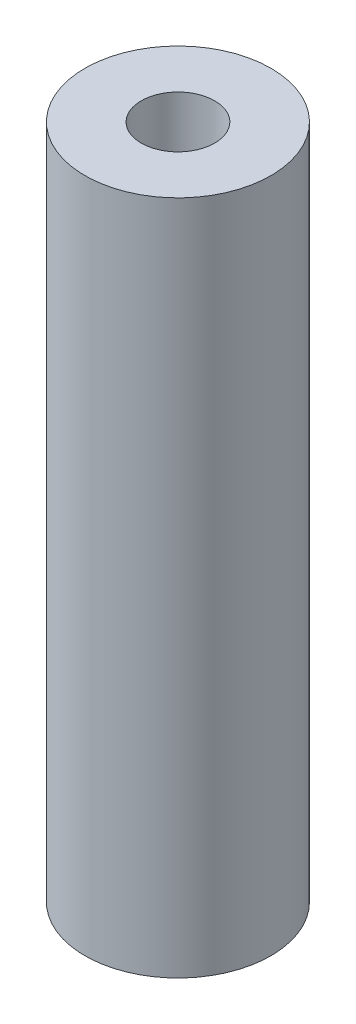
ISO-10303-21;
HEADER;
FILE_DESCRIPTION(('STEP AP214'),'2;1');
FILE_NAME('part.step','',(''),(''),'','','');
FILE_SCHEMA(('AUTOMOTIVE_DESIGN { 1 0 10303 214 1 1 1 1 }'));
ENDSEC;
DATA;
#1=APPLICATION_CONTEXT('core data for automotive mechanical design processes');
#2=APPLICATION_PROTOCOL_DEFINITION('international standard','automotive_design',2000,#1);
#3=PRODUCT_CONTEXT('',#1,'mechanical');
#4=PRODUCT('Part','Part','',(#3));
#5=PRODUCT_RELATED_PRODUCT_CATEGORY('part','',(#4));
#6=PRODUCT_DEFINITION_FORMATION('','',#4);
#7=PRODUCT_DEFINITION_CONTEXT('part definition',#1,'design');
#8=PRODUCT_DEFINITION('design','',#6,#7);
#9=PRODUCT_DEFINITION_SHAPE('','',#8);
#10=(LENGTH_UNIT() NAMED_UNIT(*) SI_UNIT(.MILLI.,.METRE.));
#11=(NAMED_UNIT(*) PLANE_ANGLE_UNIT() SI_UNIT($,.RADIAN.));
#12=(NAMED_UNIT(*) SI_UNIT($,.STERADIAN.) SOLID_ANGLE_UNIT());
#13=UNCERTAINTY_MEASURE_WITH_UNIT(LENGTH_MEASURE(1.E-05),#10,'distance_accuracy_value','');
#14=(GEOMETRIC_REPRESENTATION_CONTEXT(3) GLOBAL_UNCERTAINTY_ASSIGNED_CONTEXT((#13)) GLOBAL_UNIT_ASSIGNED_CONTEXT((#10,
#11,#12)) REPRESENTATION_CONTEXT('',''));
#15=CARTESIAN_POINT('',(0.,0.,0.));
#16=DIRECTION('',(0.,0.,1.));
#17=DIRECTION('',(1.,0.,0.));
#18=AXIS2_PLACEMENT_3D('',#15,#16,#17);
#19=CARTESIAN_POINT('',(0.,19.05,0.));
#20=DIRECTION('',(0.,1.,0.));
#21=DIRECTION('',(0.,0.,1.));
#22=AXIS2_PLACEMENT_3D('',#19,#20,#21);
#23=PLANE('',#22);
#24=CARTESIAN_POINT('',(0.,19.05,0.));
#25=DIRECTION('',(0.,1.,0.));
#26=DIRECTION('',(0.,0.,1.));
#27=AXIS2_PLACEMENT_3D('',#24,#25,#26);
#28=CIRCLE('',#27,5.2451);
#29=CARTESIAN_POINT('',(0.,19.05,-5.2451));
#30=VERTEX_POINT('',#29);
#31=EDGE_CURVE('E10',#30,#30,#28,.T.);
#32=ORIENTED_EDGE('',*,*,#31,.T.);
#33=EDGE_LOOP('',(#32));
#34=FACE_BOUND('',#33,.T.);
#35=CARTESIAN_POINT('',(0.,19.05,0.));
#36=DIRECTION('',(0.,1.,0.));
#37=DIRECTION('',(0.,0.,1.));
#38=AXIS2_PLACEMENT_3D('',#35,#36,#37);
#39=CIRCLE('',#38,2.0701);
#40=CARTESIAN_POINT('',(0.,19.05,-2.0701));
#41=VERTEX_POINT('',#40);
#42=EDGE_CURVE('E43',#41,#41,#39,.T.);
#43=ORIENTED_EDGE('',*,*,#42,.F.);
#44=EDGE_LOOP('',(#43));
#45=FACE_BOUND('',#44,.T.);
#46=ADVANCED_FACE('F32',(#34,#45),#23,.T.);
#47=CARTESIAN_POINT('',(0.,-19.05,0.));
#48=DIRECTION('',(0.,1.,0.));
#49=DIRECTION('',(0.,0.,1.));
#50=AXIS2_PLACEMENT_3D('',#47,#48,#49);
#51=PLANE('',#50);
#52=CARTESIAN_POINT('',(0.,-19.05,0.));
#53=DIRECTION('',(0.,1.,0.));
#54=DIRECTION('',(0.,0.,1.));
#55=AXIS2_PLACEMENT_3D('',#52,#53,#54);
#56=CIRCLE('',#55,5.2451);
#57=CARTESIAN_POINT('',(0.,-19.05,-5.2451));
#58=VERTEX_POINT('',#57);
#59=EDGE_CURVE('E36',#58,#58,#56,.T.);
#60=ORIENTED_EDGE('',*,*,#59,.F.);
#61=EDGE_LOOP('',(#60));
#62=FACE_BOUND('',#61,.T.);
#63=CARTESIAN_POINT('',(0.,-19.05,0.));
#64=DIRECTION('',(0.,1.,0.));
#65=DIRECTION('',(0.,0.,1.));
#66=AXIS2_PLACEMENT_3D('',#63,#64,#65);
#67=CIRCLE('',#66,2.0701);
#68=CARTESIAN_POINT('',(0.,-19.05,-2.0701));
#69=VERTEX_POINT('',#68);
#70=EDGE_CURVE('E45',#69,#69,#67,.T.);
#71=ORIENTED_EDGE('',*,*,#70,.T.);
#72=EDGE_LOOP('',(#71));
#73=FACE_BOUND('',#72,.T.);
#74=ADVANCED_FACE('F55',(#62,#73),#51,.F.);
#75=CARTESIAN_POINT('',(0.,19.05,0.));
#76=DIRECTION('',(0.,-1.,0.));
#77=DIRECTION('',(0.,0.,-1.));
#78=AXIS2_PLACEMENT_3D('',#75,#76,#77);
#79=CYLINDRICAL_SURFACE('',#78,5.2451);
#80=CARTESIAN_POINT('',(0.,19.05,-5.2451));
#81=CARTESIAN_POINT('',(0.,18.653125,-5.2451));
#82=CARTESIAN_POINT('',(0.,18.25625,-5.2451));
#83=CARTESIAN_POINT('',(0.,17.4625,-5.2451));
#84=CARTESIAN_POINT('',(0.,17.065625,-5.2451));
#85=CARTESIAN_POINT('',(0.,16.271875,-5.2451));
#86=CARTESIAN_POINT('',(0.,15.875,-5.2451));
#87=CARTESIAN_POINT('',(0.,15.08125,-5.2451));
#88=CARTESIAN_POINT('',(0.,14.684375,-5.2451));
#89=CARTESIAN_POINT('',(0.,13.890625,-5.2451));
#90=CARTESIAN_POINT('',(0.,13.49375,-5.2451));
#91=CARTESIAN_POINT('',(0.,12.7,-5.2451));
#92=CARTESIAN_POINT('',(0.,12.303125,-5.2451));
#93=CARTESIAN_POINT('',(0.,11.509375,-5.2451));
#94=CARTESIAN_POINT('',(0.,11.1125,-5.2451));
#95=CARTESIAN_POINT('',(0.,10.31875,-5.2451));
#96=CARTESIAN_POINT('',(0.,9.921875,-5.2451));
#97=CARTESIAN_POINT('',(0.,9.128125,-5.2451));
#98=CARTESIAN_POINT('',(0.,8.73125,-5.2451));
#99=CARTESIAN_POINT('',(0.,7.9375,-5.2451));
#100=CARTESIAN_POINT('',(0.,7.540625,-5.2451));
#101=CARTESIAN_POINT('',(0.,6.746875,-5.2451));
#102=CARTESIAN_POINT('',(0.,6.35,-5.2451));
#103=CARTESIAN_POINT('',(0.,5.55625,-5.2451));
#104=CARTESIAN_POINT('',(0.,5.159375,-5.2451));
#105=CARTESIAN_POINT('',(0.,4.365625,-5.2451));
#106=CARTESIAN_POINT('',(0.,3.96875,-5.2451));
#107=CARTESIAN_POINT('',(0.,3.175,-5.2451));
#108=CARTESIAN_POINT('',(0.,2.778125,-5.2451));
#109=CARTESIAN_POINT('',(0.,1.984375,-5.2451));
#110=CARTESIAN_POINT('',(0.,1.5875,-5.2451));
#111=CARTESIAN_POINT('',(0.,0.79375,-5.2451));
#112=CARTESIAN_POINT('',(0.,0.396875,-5.2451));
#113=CARTESIAN_POINT('',(0.,-0.396875,-5.2451));
#114=CARTESIAN_POINT('',(0.,-0.79375,-5.2451));
#115=CARTESIAN_POINT('',(0.,-1.5875,-5.2451));
#116=CARTESIAN_POINT('',(0.,-1.984375,-5.2451));
#117=CARTESIAN_POINT('',(0.,-2.778125,-5.2451));
#118=CARTESIAN_POINT('',(0.,-3.175,-5.2451));
#119=CARTESIAN_POINT('',(0.,-3.96875,-5.2451));
#120=CARTESIAN_POINT('',(0.,-4.365625,-5.2451));
#121=CARTESIAN_POINT('',(0.,-5.159375,-5.2451));
#122=CARTESIAN_POINT('',(0.,-5.55625,-5.2451));
#123=CARTESIAN_POINT('',(0.,-6.35,-5.2451));
#124=CARTESIAN_POINT('',(0.,-6.746875,-5.2451));
#125=CARTESIAN_POINT('',(0.,-7.540625,-5.2451));
#126=CARTESIAN_POINT('',(0.,-7.9375,-5.2451));
#127=CARTESIAN_POINT('',(0.,-8.73125,-5.2451));
#128=CARTESIAN_POINT('',(0.,-9.128125,-5.2451));
#129=CARTESIAN_POINT('',(0.,-9.921875,-5.2451));
#130=CARTESIAN_POINT('',(0.,-10.31875,-5.2451));
#131=CARTESIAN_POINT('',(0.,-11.1125,-5.2451));
#132=CARTESIAN_POINT('',(0.,-11.509375,-5.2451));
#133=CARTESIAN_POINT('',(0.,-12.303125,-5.2451));
#134=CARTESIAN_POINT('',(0.,-12.7,-5.2451));
#135=CARTESIAN_POINT('',(0.,-13.49375,-5.2451));
#136=CARTESIAN_POINT('',(0.,-13.890625,-5.2451));
#137=CARTESIAN_POINT('',(0.,-14.684375,-5.2451));
#138=CARTESIAN_POINT('',(0.,-15.08125,-5.2451));
#139=CARTESIAN_POINT('',(0.,-15.875,-5.2451));
#140=CARTESIAN_POINT('',(0.,-16.271875,-5.2451));
#141=CARTESIAN_POINT('',(0.,-17.065625,-5.2451));
#142=CARTESIAN_POINT('',(0.,-17.4625,-5.2451));
#143=CARTESIAN_POINT('',(0.,-18.25625,-5.2451));
#144=CARTESIAN_POINT('',(0.,-18.653125,-5.2451));
#145=CARTESIAN_POINT('',(0.,-19.05,-5.2451));
#146=B_SPLINE_CURVE_WITH_KNOTS('',3,(#80,#81,#82,#83,#84,#85,#86,#87,#88,#89,#90,#91,#92,#93,
#94,#95,#96,#97,#98,#99,#100,#101,#102,#103,#104,#105,#106,#107,#108,#109,#110,#111,#112,#113,
#114,#115,#116,#117,#118,#119,#120,#121,#122,#123,#124,#125,#126,#127,#128,#129,#130,#131,#132,
#133,#134,#135,#136,#137,#138,#139,#140,#141,#142,#143,#144,#145),.UNSPECIFIED.,.F.,.F.,(4,2,2,
2,2,2,2,2,2,2,2,2,2,2,2,2,2,2,2,2,2,2,2,2,2,2,2,2,2,2,2,2,4),(0.,1.190625,2.38125,3.571875,
4.7625,5.953125,7.14375,8.334375,9.525,10.715625,11.90625,13.096875,14.2875,15.478125,16.66875,
17.859375,19.05,20.240625,21.43125,22.621875,23.8125,25.003125,26.19375,27.384375,28.575,
29.765625,30.95625,32.146875,33.3375,34.528125,35.71875,36.909375,38.1),.UNSPECIFIED.);
#147=EDGE_CURVE('BSEAM34',#30,#58,#146,.T.);
#148=ORIENTED_EDGE('',*,*,#31,.F.);
#149=ORIENTED_EDGE('',*,*,#59,.T.);
#150=ORIENTED_EDGE('',*,*,#147,.T.);
#151=ORIENTED_EDGE('',*,*,#147,.F.);
#152=EDGE_LOOP('',(#148,#150,#149,#151));
#153=FACE_BOUND('',#152,.T.);
#154=ADVANCED_FACE('F34',(#153),#79,.T.);
#155=CARTESIAN_POINT('',(0.,19.05,0.));
#156=DIRECTION('',(0.,-1.,0.));
#157=DIRECTION('',(0.,0.,-1.));
#158=AXIS2_PLACEMENT_3D('',#155,#156,#157);
#159=CYLINDRICAL_SURFACE('',#158,2.0701);
#160=CARTESIAN_POINT('',(0.,19.05,-2.0701));
#161=CARTESIAN_POINT('',(0.,18.653125,-2.0701));
#162=CARTESIAN_POINT('',(0.,18.25625,-2.0701));
#163=CARTESIAN_POINT('',(0.,17.4625,-2.0701));
#164=CARTESIAN_POINT('',(0.,17.065625,-2.0701));
#165=CARTESIAN_POINT('',(0.,16.271875,-2.0701));
#166=CARTESIAN_POINT('',(0.,15.875,-2.0701));
#167=CARTESIAN_POINT('',(0.,15.08125,-2.0701));
#168=CARTESIAN_POINT('',(0.,14.684375,-2.0701));
#169=CARTESIAN_POINT('',(0.,13.890625,-2.0701));
#170=CARTESIAN_POINT('',(0.,13.49375,-2.0701));
#171=CARTESIAN_POINT('',(0.,12.7,-2.0701));
#172=CARTESIAN_POINT('',(0.,12.303125,-2.0701));
#173=CARTESIAN_POINT('',(0.,11.509375,-2.0701));
#174=CARTESIAN_POINT('',(0.,11.1125,-2.0701));
#175=CARTESIAN_POINT('',(0.,10.31875,-2.0701));
#176=CARTESIAN_POINT('',(0.,9.921875,-2.0701));
#177=CARTESIAN_POINT('',(0.,9.128125,-2.0701));
#178=CARTESIAN_POINT('',(0.,8.73125,-2.0701));
#179=CARTESIAN_POINT('',(0.,7.9375,-2.0701));
#180=CARTESIAN_POINT('',(0.,7.540625,-2.0701));
#181=CARTESIAN_POINT('',(0.,6.746875,-2.0701));
#182=CARTESIAN_POINT('',(0.,6.35,-2.0701));
#183=CARTESIAN_POINT('',(0.,5.55625,-2.0701));
#184=CARTESIAN_POINT('',(0.,5.159375,-2.0701));
#185=CARTESIAN_POINT('',(0.,4.365625,-2.0701));
#186=CARTESIAN_POINT('',(0.,3.96875,-2.0701));
#187=CARTESIAN_POINT('',(0.,3.175,-2.0701));
#188=CARTESIAN_POINT('',(0.,2.778125,-2.0701));
#189=CARTESIAN_POINT('',(0.,1.984375,-2.0701));
#190=CARTESIAN_POINT('',(0.,1.5875,-2.0701));
#191=CARTESIAN_POINT('',(0.,0.79375,-2.0701));
#192=CARTESIAN_POINT('',(0.,0.396875,-2.0701));
#193=CARTESIAN_POINT('',(0.,-0.396875,-2.0701));
#194=CARTESIAN_POINT('',(0.,-0.79375,-2.0701));
#195=CARTESIAN_POINT('',(0.,-1.5875,-2.0701));
#196=CARTESIAN_POINT('',(0.,-1.984375,-2.0701));
#197=CARTESIAN_POINT('',(0.,-2.778125,-2.0701));
#198=CARTESIAN_POINT('',(0.,-3.175,-2.0701));
#199=CARTESIAN_POINT('',(0.,-3.96875,-2.0701));
#200=CARTESIAN_POINT('',(0.,-4.365625,-2.0701));
#201=CARTESIAN_POINT('',(0.,-5.159375,-2.0701));
#202=CARTESIAN_POINT('',(0.,-5.55625,-2.0701));
#203=CARTESIAN_POINT('',(0.,-6.35,-2.0701));
#204=CARTESIAN_POINT('',(0.,-6.746875,-2.0701));
#205=CARTESIAN_POINT('',(0.,-7.540625,-2.0701));
#206=CARTESIAN_POINT('',(0.,-7.9375,-2.0701));
#207=CARTESIAN_POINT('',(0.,-8.73125,-2.0701));
#208=CARTESIAN_POINT('',(0.,-9.128125,-2.0701));
#209=CARTESIAN_POINT('',(0.,-9.921875,-2.0701));
#210=CARTESIAN_POINT('',(0.,-10.31875,-2.0701));
#211=CARTESIAN_POINT('',(0.,-11.1125,-2.0701));
#212=CARTESIAN_POINT('',(0.,-11.509375,-2.0701));
#213=CARTESIAN_POINT('',(0.,-12.303125,-2.0701));
#214=CARTESIAN_POINT('',(0.,-12.7,-2.0701));
#215=CARTESIAN_POINT('',(0.,-13.49375,-2.0701));
#216=CARTESIAN_POINT('',(0.,-13.890625,-2.0701));
#217=CARTESIAN_POINT('',(0.,-14.684375,-2.0701));
#218=CARTESIAN_POINT('',(0.,-15.08125,-2.0701));
#219=CARTESIAN_POINT('',(0.,-15.875,-2.0701));
#220=CARTESIAN_POINT('',(0.,-16.271875,-2.0701));
#221=CARTESIAN_POINT('',(0.,-17.065625,-2.0701));
#222=CARTESIAN_POINT('',(0.,-17.4625,-2.0701));
#223=CARTESIAN_POINT('',(0.,-18.25625,-2.0701));
#224=CARTESIAN_POINT('',(0.,-18.653125,-2.0701));
#225=CARTESIAN_POINT('',(0.,-19.05,-2.0701));
#226=B_SPLINE_CURVE_WITH_KNOTS('',3,(#160,#161,#162,#163,#164,#165,#166,#167,#168,#169,#170,
#171,#172,#173,#174,#175,#176,#177,#178,#179,#180,#181,#182,#183,#184,#185,#186,#187,#188,#189,
#190,#191,#192,#193,#194,#195,#196,#197,#198,#199,#200,#201,#202,#203,#204,#205,#206,#207,#208,
#209,#210,#211,#212,#213,#214,#215,#216,#217,#218,#219,#220,#221,#222,#223,#224,#225),
.UNSPECIFIED.,.F.,.F.,(4,2,2,2,2,2,2,2,2,2,2,2,2,2,2,2,2,2,2,2,2,2,2,2,2,2,2,2,2,2,2,2,4),(0.,
1.190625,2.38125,3.571875,4.7625,5.953125,7.14375,8.334375,9.525,10.715625,11.90625,13.096875,
14.2875,15.478125,16.66875,17.859375,19.05,20.240625,21.43125,22.621875,23.8125,25.003125,
26.19375,27.384375,28.575,29.765625,30.95625,32.146875,33.3375,34.528125,35.71875,36.909375,
38.1),.UNSPECIFIED.);
#227=EDGE_CURVE('BSEAM51',#41,#69,#226,.T.);
#228=ORIENTED_EDGE('',*,*,#42,.T.);
#229=ORIENTED_EDGE('',*,*,#70,.F.);
#230=ORIENTED_EDGE('',*,*,#227,.T.);
#231=ORIENTED_EDGE('',*,*,#227,.F.);
#232=EDGE_LOOP('',(#228,#230,#229,#231));
#233=FACE_BOUND('',#232,.T.);
#234=ADVANCED_FACE('F51',(#233),#159,.F.);
#235=CLOSED_SHELL('',(#46,#74,#154,#234));
#236=MANIFOLD_SOLID_BREP('B2',#235);
#237=ADVANCED_BREP_SHAPE_REPRESENTATION('',(#18,#236),#14);
#238=SHAPE_DEFINITION_REPRESENTATION(#9,#237);
ENDSEC;
END-ISO-10303-21;
